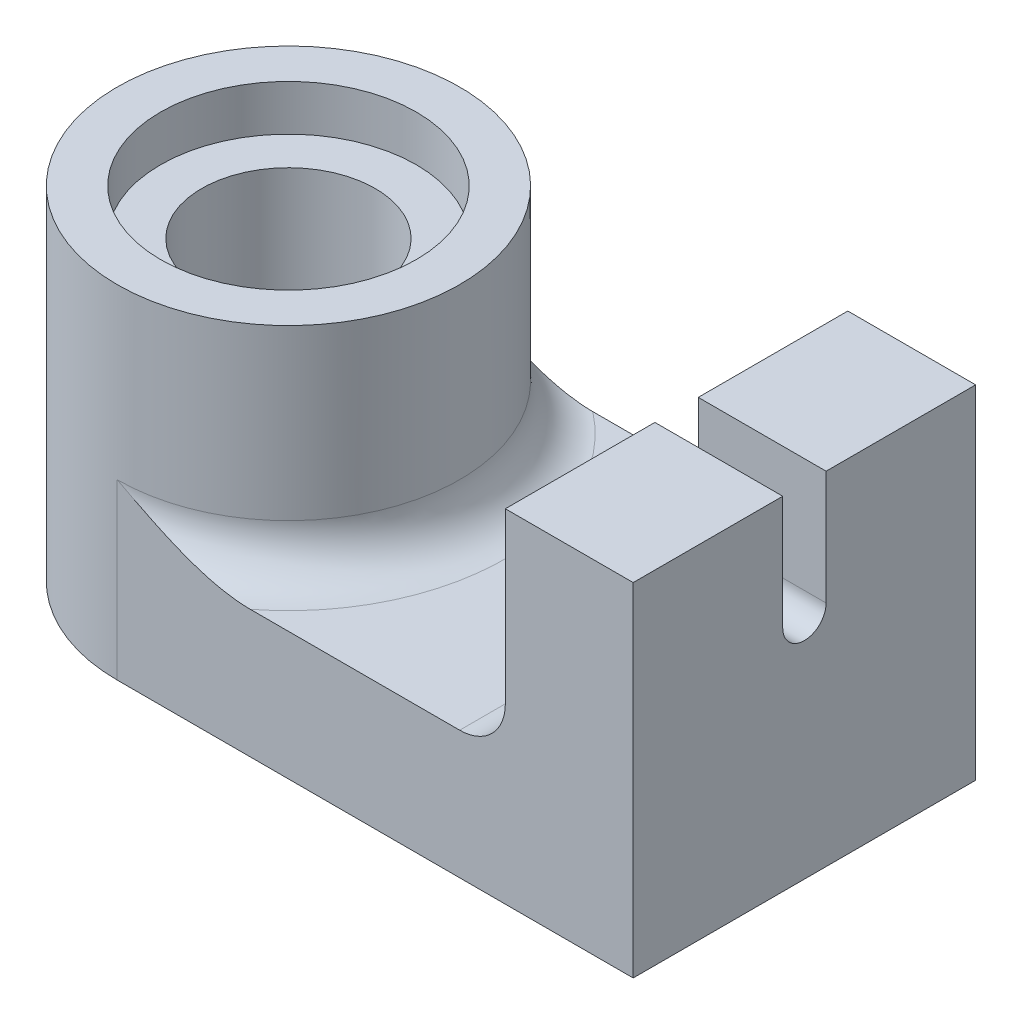
ISO-10303-21;
HEADER;
FILE_DESCRIPTION(('STEP AP214'),'2;1');
FILE_NAME('part.step','',(''),(''),'','','');
FILE_SCHEMA(('AUTOMOTIVE_DESIGN { 1 0 10303 214 1 1 1 1 }'));
ENDSEC;
DATA;
#1=APPLICATION_CONTEXT('core data for automotive mechanical design processes');
#2=APPLICATION_PROTOCOL_DEFINITION('international standard','automotive_design',2000,#1);
#3=PRODUCT_CONTEXT('',#1,'mechanical');
#4=PRODUCT('Part','Part','',(#3));
#5=PRODUCT_RELATED_PRODUCT_CATEGORY('part','',(#4));
#6=PRODUCT_DEFINITION_FORMATION('','',#4);
#7=PRODUCT_DEFINITION_CONTEXT('part definition',#1,'design');
#8=PRODUCT_DEFINITION('design','',#6,#7);
#9=PRODUCT_DEFINITION_SHAPE('','',#8);
#10=(LENGTH_UNIT() NAMED_UNIT(*) SI_UNIT(.MILLI.,.METRE.));
#11=(NAMED_UNIT(*) PLANE_ANGLE_UNIT() SI_UNIT($,.RADIAN.));
#12=(NAMED_UNIT(*) SI_UNIT($,.STERADIAN.) SOLID_ANGLE_UNIT());
#13=UNCERTAINTY_MEASURE_WITH_UNIT(LENGTH_MEASURE(1.E-05),#10,'distance_accuracy_value','');
#14=(GEOMETRIC_REPRESENTATION_CONTEXT(3) GLOBAL_UNCERTAINTY_ASSIGNED_CONTEXT((#13)) GLOBAL_UNIT_ASSIGNED_CONTEXT((#10,
#11,#12)) REPRESENTATION_CONTEXT('',''));
#15=CARTESIAN_POINT('',(0.,0.,0.));
#16=DIRECTION('',(0.,0.,1.));
#17=DIRECTION('',(1.,0.,0.));
#18=AXIS2_PLACEMENT_3D('',#15,#16,#17);
#19=CARTESIAN_POINT('',(56.5,28.,37.5));
#20=DIRECTION('',(-1.,0.,0.));
#21=DIRECTION('',(0.,0.,1.));
#22=AXIS2_PLACEMENT_3D('',#19,#20,#21);
#23=PLANE('',#22);
#24=DIRECTION('',(0.,1.,0.));
#25=VECTOR('',#24,1.);
#26=CARTESIAN_POINT('',(56.5,0.,4.74999999999999));
#27=LINE('',#26,#25);
#28=CARTESIAN_POINT('',(56.5,50.,4.74999999999999));
#29=VERTEX_POINT('',#28);
#30=CARTESIAN_POINT('',(56.5,75.,4.74999999999999));
#31=VERTEX_POINT('',#30);
#32=EDGE_CURVE('E162',#29,#31,#27,.T.);
#33=ORIENTED_EDGE('',*,*,#32,.T.);
#34=DIRECTION('',(0.,0.,-1.));
#35=VECTOR('',#34,1.);
#36=CARTESIAN_POINT('',(56.5,75.,-37.5));
#37=LINE('',#36,#35);
#38=CARTESIAN_POINT('',(56.5,75.,37.5));
#39=VERTEX_POINT('',#38);
#40=EDGE_CURVE('E182',#39,#31,#37,.T.);
#41=ORIENTED_EDGE('',*,*,#40,.F.);
#42=DIRECTION('',(0.,-1.,0.));
#43=VECTOR('',#42,1.);
#44=CARTESIAN_POINT('',(56.5,28.,37.5));
#45=LINE('',#44,#43);
#46=CARTESIAN_POINT('',(56.5,0.,37.5));
#47=VERTEX_POINT('',#46);
#48=EDGE_CURVE('E256',#39,#47,#45,.T.);
#49=ORIENTED_EDGE('',*,*,#48,.T.);
#50=DIRECTION('',(0.,0.,-1.));
#51=VECTOR('',#50,1.);
#52=CARTESIAN_POINT('',(56.5,0.,37.5));
#53=LINE('',#52,#51);
#54=CARTESIAN_POINT('',(56.5,0.,-37.5));
#55=VERTEX_POINT('',#54);
#56=EDGE_CURVE('E248',#47,#55,#53,.T.);
#57=ORIENTED_EDGE('',*,*,#56,.T.);
#58=DIRECTION('',(0.,-1.,0.));
#59=VECTOR('',#58,1.);
#60=CARTESIAN_POINT('',(56.5,28.,-37.5));
#61=LINE('',#60,#59);
#62=CARTESIAN_POINT('',(56.5,75.,-37.5));
#63=VERTEX_POINT('',#62);
#64=EDGE_CURVE('E259',#63,#55,#61,.T.);
#65=ORIENTED_EDGE('',*,*,#64,.F.);
#66=CARTESIAN_POINT('',(56.5,75.,-4.75));
#67=VERTEX_POINT('',#66);
#68=EDGE_CURVE('E174',#67,#63,#37,.T.);
#69=ORIENTED_EDGE('',*,*,#68,.F.);
#70=DIRECTION('',(0.,1.,0.));
#71=VECTOR('',#70,1.);
#72=CARTESIAN_POINT('',(56.5,0.,-4.75));
#73=LINE('',#72,#71);
#74=CARTESIAN_POINT('',(56.5,50.,-4.75));
#75=VERTEX_POINT('',#74);
#76=EDGE_CURVE('E155',#75,#67,#73,.T.);
#77=ORIENTED_EDGE('',*,*,#76,.F.);
#78=CARTESIAN_POINT('',(56.5,50.,0.));
#79=DIRECTION('',(1.,0.,0.));
#80=DIRECTION('',(0.,0.,-1.));
#81=AXIS2_PLACEMENT_3D('',#78,#79,#80);
#82=CIRCLE('',#81,4.75);
#83=EDGE_CURVE('E165',#29,#75,#82,.T.);
#84=ORIENTED_EDGE('',*,*,#83,.F.);
#85=EDGE_LOOP('',(#33,#41,#49,#57,#65,#69,#77,#84));
#86=FACE_BOUND('',#85,.T.);
#87=ADVANCED_FACE('F39',(#86),#23,.F.);
#88=CARTESIAN_POINT('',(28.5,75.,-37.5));
#89=DIRECTION('',(1.,0.,0.));
#90=DIRECTION('',(0.,0.,-1.));
#91=AXIS2_PLACEMENT_3D('',#88,#89,#90);
#92=PLANE('',#91);
#93=DIRECTION('',(0.,-1.,0.));
#94=VECTOR('',#93,1.);
#95=CARTESIAN_POINT('',(28.5,75.,-37.5));
#96=LINE('',#95,#94);
#97=CARTESIAN_POINT('',(28.5,75.,-37.5));
#98=VERTEX_POINT('',#97);
#99=CARTESIAN_POINT('',(28.5,38.,-37.5));
#100=VERTEX_POINT('',#99);
#101=EDGE_CURVE('E196',#98,#100,#96,.T.);
#102=ORIENTED_EDGE('',*,*,#101,.T.);
#103=DIRECTION('',(0.,0.,1.));
#104=VECTOR('',#103,1.);
#105=CARTESIAN_POINT('',(28.5,38.,37.5));
#106=LINE('',#105,#104);
#107=CARTESIAN_POINT('',(28.5,38.,37.5));
#108=VERTEX_POINT('',#107);
#109=EDGE_CURVE('E371',#100,#108,#106,.T.);
#110=ORIENTED_EDGE('',*,*,#109,.T.);
#111=DIRECTION('',(0.,-1.,0.));
#112=VECTOR('',#111,1.);
#113=CARTESIAN_POINT('',(28.5,75.,37.5));
#114=LINE('',#113,#112);
#115=CARTESIAN_POINT('',(28.5,75.,37.5));
#116=VERTEX_POINT('',#115);
#117=EDGE_CURVE('E194',#116,#108,#114,.T.);
#118=ORIENTED_EDGE('',*,*,#117,.F.);
#119=DIRECTION('',(0.,0.,1.));
#120=VECTOR('',#119,1.);
#121=CARTESIAN_POINT('',(28.5,75.,-37.5));
#122=LINE('',#121,#120);
#123=CARTESIAN_POINT('',(28.5,75.,4.74999999999999));
#124=VERTEX_POINT('',#123);
#125=EDGE_CURVE('E187',#124,#116,#122,.T.);
#126=ORIENTED_EDGE('',*,*,#125,.F.);
#127=DIRECTION('',(0.,1.,0.));
#128=VECTOR('',#127,1.);
#129=CARTESIAN_POINT('',(28.5,75.,4.75));
#130=LINE('',#129,#128);
#131=CARTESIAN_POINT('',(28.5,50.,4.74999999999999));
#132=VERTEX_POINT('',#131);
#133=EDGE_CURVE('E180',#132,#124,#130,.T.);
#134=ORIENTED_EDGE('',*,*,#133,.F.);
#135=CARTESIAN_POINT('',(28.5,50.,0.));
#136=DIRECTION('',(1.,0.,0.));
#137=DIRECTION('',(0.,0.,-1.));
#138=AXIS2_PLACEMENT_3D('',#135,#136,#137);
#139=CIRCLE('',#138,4.75);
#140=CARTESIAN_POINT('',(28.5,50.,-4.75));
#141=VERTEX_POINT('',#140);
#142=EDGE_CURVE('E373',#132,#141,#139,.T.);
#143=ORIENTED_EDGE('',*,*,#142,.T.);
#144=DIRECTION('',(0.,1.,0.));
#145=VECTOR('',#144,1.);
#146=CARTESIAN_POINT('',(28.5,75.,-4.75));
#147=LINE('',#146,#145);
#148=CARTESIAN_POINT('',(28.5,75.,-4.75));
#149=VERTEX_POINT('',#148);
#150=EDGE_CURVE('E158',#141,#149,#147,.T.);
#151=ORIENTED_EDGE('',*,*,#150,.T.);
#152=EDGE_CURVE('E188',#98,#149,#122,.T.);
#153=ORIENTED_EDGE('',*,*,#152,.F.);
#154=EDGE_LOOP('',(#102,#110,#118,#126,#134,#143,#151,#153));
#155=FACE_BOUND('',#154,.T.);
#156=ADVANCED_FACE('F316',(#155),#92,.F.);
#157=CARTESIAN_POINT('',(0.,75.,0.));
#158=DIRECTION('',(0.,-1.,0.));
#159=DIRECTION('',(0.,0.,-1.));
#160=AXIS2_PLACEMENT_3D('',#157,#158,#159);
#161=PLANE('',#160);
#162=DIRECTION('',(1.,0.,0.));
#163=VECTOR('',#162,1.);
#164=CARTESIAN_POINT('',(0.,75.,4.74999999999999));
#165=LINE('',#164,#163);
#166=EDGE_CURVE('E377',#124,#31,#165,.T.);
#167=ORIENTED_EDGE('',*,*,#166,.F.);
#168=ORIENTED_EDGE('',*,*,#125,.T.);
#169=DIRECTION('',(1.,0.,0.));
#170=VECTOR('',#169,1.);
#171=CARTESIAN_POINT('',(56.5,75.,37.5));
#172=LINE('',#171,#170);
#173=EDGE_CURVE('E191',#116,#39,#172,.T.);
#174=ORIENTED_EDGE('',*,*,#173,.T.);
#175=ORIENTED_EDGE('',*,*,#40,.T.);
#176=EDGE_LOOP('',(#167,#168,#174,#175));
#177=FACE_BOUND('',#176,.T.);
#178=ADVANCED_FACE('F321',(#177),#161,.F.);
#179=CARTESIAN_POINT('',(0.,28.,0.));
#180=DIRECTION('',(0.,-1.,0.));
#181=DIRECTION('',(0.,0.,-1.));
#182=AXIS2_PLACEMENT_3D('',#179,#180,#181);
#183=PLANE('',#182);
#184=DIRECTION('',(1.,0.,0.));
#185=VECTOR('',#184,1.);
#186=CARTESIAN_POINT('',(-56.5,28.,37.5));
#187=LINE('',#186,#185);
#188=CARTESIAN_POINT('',(-27.3452405257735,28.,37.5));
#189=VERTEX_POINT('',#188);
#190=CARTESIAN_POINT('',(18.5,28.,37.5));
#191=VERTEX_POINT('',#190);
#192=EDGE_CURVE('E242',#189,#191,#187,.T.);
#193=ORIENTED_EDGE('',*,*,#192,.T.);
#194=DIRECTION('',(0.,0.,1.));
#195=VECTOR('',#194,1.);
#196=CARTESIAN_POINT('',(18.5,28.,-37.5));
#197=LINE('',#196,#195);
#198=CARTESIAN_POINT('',(18.5,28.,-37.5));
#199=VERTEX_POINT('',#198);
#200=EDGE_CURVE('E60',#191,#199,#197,.F.);
#201=ORIENTED_EDGE('',*,*,#200,.T.);
#202=DIRECTION('',(1.,0.,0.));
#203=VECTOR('',#202,1.);
#204=CARTESIAN_POINT('',(-56.5,28.,-37.5));
#205=LINE('',#204,#203);
#206=CARTESIAN_POINT('',(-27.3452405257735,28.,-37.5));
#207=VERTEX_POINT('',#206);
#208=EDGE_CURVE('E240',#207,#199,#205,.T.);
#209=ORIENTED_EDGE('',*,*,#208,.F.);
#210=CARTESIAN_POINT('',(-56.5,28.,0.));
#211=DIRECTION('',(0.,-1.,0.));
#212=DIRECTION('',(0.,0.,-1.));
#213=AXIS2_PLACEMENT_3D('',#210,#211,#212);
#214=CIRCLE('',#213,47.5);
#215=EDGE_CURVE('E266',#207,#189,#214,.T.);
#216=ORIENTED_EDGE('',*,*,#215,.T.);
#217=EDGE_LOOP('',(#193,#201,#209,#216));
#218=FACE_BOUND('',#217,.T.);
#219=ADVANCED_FACE('F328',(#218),#183,.F.);
#220=CARTESIAN_POINT('',(-56.5,-54.,0.));
#221=DIRECTION('',(0.,1.,0.));
#222=DIRECTION('',(0.,0.,1.));
#223=AXIS2_PLACEMENT_3D('',#220,#221,#222);
#224=CYLINDRICAL_SURFACE('',#223,19.);
#225=CARTESIAN_POINT('',(-56.5,9.99999999999999,0.));
#226=DIRECTION('',(0.,-1.,0.));
#227=DIRECTION('',(0.,0.,-1.));
#228=AXIS2_PLACEMENT_3D('',#225,#226,#227);
#229=CIRCLE('',#228,19.);
#230=CARTESIAN_POINT('',(-38.1696972201766,9.99999999999999,-4.99999999999999));
#231=VERTEX_POINT('',#230);
#232=CARTESIAN_POINT('',(-38.1696972201766,9.99999999999999,5.00000000000001));
#233=VERTEX_POINT('',#232);
#234=EDGE_CURVE('E211',#231,#233,#229,.F.);
#235=ORIENTED_EDGE('',*,*,#234,.F.);
#236=DIRECTION('',(0.,1.,0.));
#237=VECTOR('',#236,1.);
#238=CARTESIAN_POINT('',(-38.1696972201766,-54.,-4.99999999999999));
#239=LINE('',#238,#237);
#240=CARTESIAN_POINT('',(-38.1696972201766,65.,-4.99999999999999));
#241=VERTEX_POINT('',#240);
#242=EDGE_CURVE('E226',#231,#241,#239,.T.);
#243=ORIENTED_EDGE('',*,*,#242,.T.);
#244=CARTESIAN_POINT('',(-56.5,65.,0.));
#245=DIRECTION('',(0.,1.,0.));
#246=DIRECTION('',(0.,0.,1.));
#247=AXIS2_PLACEMENT_3D('',#244,#245,#246);
#248=CIRCLE('',#247,19.);
#249=CARTESIAN_POINT('',(-38.1696972201766,65.,5.00000000000001));
#250=VERTEX_POINT('',#249);
#251=EDGE_CURVE('E213',#241,#250,#248,.T.);
#252=ORIENTED_EDGE('',*,*,#251,.T.);
#253=DIRECTION('',(0.,1.,0.));
#254=VECTOR('',#253,1.);
#255=CARTESIAN_POINT('',(-38.1696972201766,-54.,5.00000000000001));
#256=LINE('',#255,#254);
#257=EDGE_CURVE('E225',#233,#250,#256,.T.);
#258=ORIENTED_EDGE('',*,*,#257,.F.);
#259=EDGE_LOOP('',(#235,#243,#252,#258));
#260=FACE_BOUND('',#259,.T.);
#261=ADVANCED_FACE('F347',(#260),#224,.F.);
#262=CARTESIAN_POINT('',(0.,-54.,-4.99999999999999));
#263=DIRECTION('',(0.,0.,1.));
#264=DIRECTION('',(1.,0.,0.));
#265=AXIS2_PLACEMENT_3D('',#262,#263,#264);
#266=PLANE('',#265);
#267=ORIENTED_EDGE('',*,*,#242,.F.);
#268=DIRECTION('',(1.,0.,0.));
#269=VECTOR('',#268,1.);
#270=CARTESIAN_POINT('',(0.,9.99999999999999,-4.99999999999999));
#271=LINE('',#270,#269);
#272=CARTESIAN_POINT('',(-34.5,9.99999999999999,-4.99999999999999));
#273=VERTEX_POINT('',#272);
#274=EDGE_CURVE('E208',#231,#273,#271,.T.);
#275=ORIENTED_EDGE('',*,*,#274,.T.);
#276=DIRECTION('',(0.,1.,0.));
#277=VECTOR('',#276,1.);
#278=CARTESIAN_POINT('',(-34.5,-54.,-4.99999999999999));
#279=LINE('',#278,#277);
#280=CARTESIAN_POINT('',(-34.5,65.,-4.99999999999999));
#281=VERTEX_POINT('',#280);
#282=EDGE_CURVE('E229',#273,#281,#279,.T.);
#283=ORIENTED_EDGE('',*,*,#282,.T.);
#284=DIRECTION('',(1.,0.,0.));
#285=VECTOR('',#284,1.);
#286=CARTESIAN_POINT('',(0.,65.,-4.99999999999999));
#287=LINE('',#286,#285);
#288=EDGE_CURVE('E222',#241,#281,#287,.T.);
#289=ORIENTED_EDGE('',*,*,#288,.F.);
#290=EDGE_LOOP('',(#267,#275,#283,#289));
#291=FACE_BOUND('',#290,.T.);
#292=ADVANCED_FACE('F343',(#291),#266,.T.);
#293=CARTESIAN_POINT('',(-34.5,-54.,0.));
#294=DIRECTION('',(-1.,0.,0.));
#295=DIRECTION('',(0.,0.,1.));
#296=AXIS2_PLACEMENT_3D('',#293,#294,#295);
#297=PLANE('',#296);
#298=ORIENTED_EDGE('',*,*,#282,.F.);
#299=DIRECTION('',(0.,0.,1.));
#300=VECTOR('',#299,1.);
#301=CARTESIAN_POINT('',(-34.5,9.99999999999999,0.));
#302=LINE('',#301,#300);
#303=CARTESIAN_POINT('',(-34.5,9.99999999999999,5.00000000000001));
#304=VERTEX_POINT('',#303);
#305=EDGE_CURVE('E203',#273,#304,#302,.T.);
#306=ORIENTED_EDGE('',*,*,#305,.T.);
#307=DIRECTION('',(0.,1.,0.));
#308=VECTOR('',#307,1.);
#309=CARTESIAN_POINT('',(-34.5,-54.,5.00000000000001));
#310=LINE('',#309,#308);
#311=CARTESIAN_POINT('',(-34.5,65.,5.00000000000001));
#312=VERTEX_POINT('',#311);
#313=EDGE_CURVE('E231',#304,#312,#310,.T.);
#314=ORIENTED_EDGE('',*,*,#313,.T.);
#315=DIRECTION('',(0.,0.,1.));
#316=VECTOR('',#315,1.);
#317=CARTESIAN_POINT('',(-34.5,65.,0.));
#318=LINE('',#317,#316);
#319=EDGE_CURVE('E219',#281,#312,#318,.T.);
#320=ORIENTED_EDGE('',*,*,#319,.F.);
#321=EDGE_LOOP('',(#298,#306,#314,#320));
#322=FACE_BOUND('',#321,.T.);
#323=ADVANCED_FACE('F346',(#322),#297,.T.);
#324=CARTESIAN_POINT('',(0.,-54.,5.00000000000001));
#325=DIRECTION('',(0.,0.,1.));
#326=DIRECTION('',(1.,0.,0.));
#327=AXIS2_PLACEMENT_3D('',#324,#325,#326);
#328=PLANE('',#327);
#329=DIRECTION('',(1.,0.,0.));
#330=VECTOR('',#329,1.);
#331=CARTESIAN_POINT('',(0.,9.99999999999999,5.00000000000001));
#332=LINE('',#331,#330);
#333=EDGE_CURVE('E380',#233,#304,#332,.T.);
#334=ORIENTED_EDGE('',*,*,#333,.F.);
#335=ORIENTED_EDGE('',*,*,#257,.T.);
#336=DIRECTION('',(1.,0.,0.));
#337=VECTOR('',#336,1.);
#338=CARTESIAN_POINT('',(0.,65.,5.00000000000001));
#339=LINE('',#338,#337);
#340=EDGE_CURVE('E216',#250,#312,#339,.T.);
#341=ORIENTED_EDGE('',*,*,#340,.T.);
#342=ORIENTED_EDGE('',*,*,#313,.F.);
#343=EDGE_LOOP('',(#334,#335,#341,#342));
#344=FACE_BOUND('',#343,.T.);
#345=ADVANCED_FACE('F304',(#344),#328,.F.);
#346=CARTESIAN_POINT('',(-56.5,75.,0.));
#347=DIRECTION('',(0.,-1.,0.));
#348=DIRECTION('',(0.,0.,-1.));
#349=AXIS2_PLACEMENT_3D('',#346,#347,#348);
#350=CYLINDRICAL_SURFACE('',#349,37.5);
#351=CARTESIAN_POINT('',(-56.5,75.,0.));
#352=DIRECTION('',(0.,1.,0.));
#353=DIRECTION('',(0.,0.,1.));
#354=AXIS2_PLACEMENT_3D('',#351,#352,#353);
#355=CIRCLE('',#354,37.5);
#356=CARTESIAN_POINT('',(-56.5,75.,37.5));
#357=VERTEX_POINT('',#356);
#358=EDGE_CURVE('E263',#357,#357,#355,.T.);
#359=ORIENTED_EDGE('',*,*,#358,.F.);
#360=EDGE_LOOP('',(#359));
#361=FACE_BOUND('',#360,.T.);
#362=DIRECTION('',(0.,-1.,0.));
#363=VECTOR('',#362,1.);
#364=CARTESIAN_POINT('',(-56.5,28.,37.5));
#365=LINE('',#364,#363);
#366=CARTESIAN_POINT('',(-56.5,38.,37.5));
#367=VERTEX_POINT('',#366);
#368=CARTESIAN_POINT('',(-56.5,0.,37.5));
#369=VERTEX_POINT('',#368);
#370=EDGE_CURVE('E252',#367,#369,#365,.T.);
#371=ORIENTED_EDGE('',*,*,#370,.F.);
#372=CARTESIAN_POINT('',(-56.5,38.,0.));
#373=DIRECTION('',(0.,-1.,0.));
#374=DIRECTION('',(0.,0.,-1.));
#375=AXIS2_PLACEMENT_3D('',#372,#373,#374);
#376=CIRCLE('',#375,37.5);
#377=CARTESIAN_POINT('',(-56.5,38.,-37.5));
#378=VERTEX_POINT('',#377);
#379=EDGE_CURVE('E270',#367,#378,#376,.F.);
#380=ORIENTED_EDGE('',*,*,#379,.T.);
#381=DIRECTION('',(0.,-1.,0.));
#382=VECTOR('',#381,1.);
#383=CARTESIAN_POINT('',(-56.5,28.,-37.5));
#384=LINE('',#383,#382);
#385=CARTESIAN_POINT('',(-56.5,0.,-37.5));
#386=VERTEX_POINT('',#385);
#387=EDGE_CURVE('E245',#378,#386,#384,.T.);
#388=ORIENTED_EDGE('',*,*,#387,.T.);
#389=CARTESIAN_POINT('',(-56.5,0.,0.));
#390=DIRECTION('',(0.,1.,0.));
#391=DIRECTION('',(0.,0.,1.));
#392=AXIS2_PLACEMENT_3D('',#389,#390,#391);
#393=CIRCLE('',#392,37.5);
#394=EDGE_CURVE('E255',#386,#369,#393,.T.);
#395=ORIENTED_EDGE('',*,*,#394,.T.);
#396=EDGE_LOOP('',(#371,#380,#388,#395));
#397=FACE_BOUND('',#396,.T.);
#398=ADVANCED_FACE('F299',(#361,#397),#350,.T.);
#399=CARTESIAN_POINT('',(0.,75.,0.));
#400=DIRECTION('',(0.,1.,0.));
#401=DIRECTION('',(0.,0.,1.));
#402=AXIS2_PLACEMENT_3D('',#399,#400,#401);
#403=PLANE('',#402);
#404=CARTESIAN_POINT('',(-56.5,75.,0.));
#405=DIRECTION('',(0.,1.,0.));
#406=DIRECTION('',(0.,0.,1.));
#407=AXIS2_PLACEMENT_3D('',#404,#405,#406);
#408=CIRCLE('',#407,28.);
#409=CARTESIAN_POINT('',(-56.5,75.,28.));
#410=VERTEX_POINT('',#409);
#411=EDGE_CURVE('E228',#410,#410,#408,.T.);
#412=ORIENTED_EDGE('',*,*,#411,.F.);
#413=EDGE_LOOP('',(#412));
#414=FACE_BOUND('',#413,.T.);
#415=ORIENTED_EDGE('',*,*,#358,.T.);
#416=EDGE_LOOP('',(#415));
#417=FACE_BOUND('',#416,.T.);
#418=ADVANCED_FACE('F303',(#414,#417),#403,.T.);
#419=CARTESIAN_POINT('',(0.,0.,0.));
#420=DIRECTION('',(0.,1.,0.));
#421=DIRECTION('',(0.,0.,1.));
#422=AXIS2_PLACEMENT_3D('',#419,#420,#421);
#423=PLANE('',#422);
#424=CARTESIAN_POINT('',(-56.5,0.,0.));
#425=DIRECTION('',(0.,-1.,0.));
#426=DIRECTION('',(0.,0.,-1.));
#427=AXIS2_PLACEMENT_3D('',#424,#425,#426);
#428=CIRCLE('',#427,28.);
#429=CARTESIAN_POINT('',(-56.5,0.,-28.));
#430=VERTEX_POINT('',#429);
#431=EDGE_CURVE('E199',#430,#430,#428,.T.);
#432=ORIENTED_EDGE('',*,*,#431,.F.);
#433=EDGE_LOOP('',(#432));
#434=FACE_BOUND('',#433,.T.);
#435=ORIENTED_EDGE('',*,*,#394,.F.);
#436=DIRECTION('',(1.,0.,0.));
#437=VECTOR('',#436,1.);
#438=CARTESIAN_POINT('',(-56.5,0.,-37.5));
#439=LINE('',#438,#437);
#440=EDGE_CURVE('E237',#386,#55,#439,.T.);
#441=ORIENTED_EDGE('',*,*,#440,.T.);
#442=ORIENTED_EDGE('',*,*,#56,.F.);
#443=DIRECTION('',(1.,0.,0.));
#444=VECTOR('',#443,1.);
#445=CARTESIAN_POINT('',(-56.5,0.,37.5));
#446=LINE('',#445,#444);
#447=EDGE_CURVE('E243',#369,#47,#446,.T.);
#448=ORIENTED_EDGE('',*,*,#447,.F.);
#449=EDGE_LOOP('',(#435,#441,#442,#448));
#450=FACE_BOUND('',#449,.T.);
#451=ADVANCED_FACE('F306',(#434,#450),#423,.F.);
#452=CARTESIAN_POINT('',(-56.5,28.,37.5));
#453=DIRECTION('',(0.,0.,-1.));
#454=DIRECTION('',(-1.,0.,0.));
#455=AXIS2_PLACEMENT_3D('',#452,#453,#454);
#456=PLANE('',#455);
#457=ORIENTED_EDGE('',*,*,#447,.T.);
#458=ORIENTED_EDGE('',*,*,#48,.F.);
#459=ORIENTED_EDGE('',*,*,#173,.F.);
#460=ORIENTED_EDGE('',*,*,#117,.T.);
#461=CARTESIAN_POINT('',(18.5,38.,37.5));
#462=DIRECTION('',(0.,0.,-1.));
#463=DIRECTION('',(-1.,0.,0.));
#464=AXIS2_PLACEMENT_3D('',#461,#462,#463);
#465=CIRCLE('',#464,10.);
#466=EDGE_CURVE('E47',#108,#191,#465,.T.);
#467=ORIENTED_EDGE('',*,*,#466,.T.);
#468=ORIENTED_EDGE('',*,*,#192,.F.);
#469=CARTESIAN_POINT('',(-27.3452405257735,28.,37.5));
#470=CARTESIAN_POINT('',(-27.7718306786814,28.0000213351898,37.5));
#471=CARTESIAN_POINT('',(-28.1983439980087,28.0102823714578,37.5));
#472=CARTESIAN_POINT('',(-29.0503515250905,28.0497436177265,37.5));
#473=CARTESIAN_POINT('',(-29.4758460433027,28.078937038766,37.5));
#474=CARTESIAN_POINT('',(-30.3244061649618,28.1546490977715,37.5));
#475=CARTESIAN_POINT('',(-30.747474927234,28.2011328970027,37.5));
#476=CARTESIAN_POINT('',(-31.5915690352663,28.3100570735705,37.5));
#477=CARTESIAN_POINT('',(-32.0125941747222,28.3724990290993,37.5));
#478=CARTESIAN_POINT('',(-33.2616269037703,28.580089301683,37.5));
#479=CARTESIAN_POINT('',(-34.0861499526015,28.7465122101843,37.5));
#480=CARTESIAN_POINT('',(-35.7241867313919,29.1277255658476,37.5));
#481=CARTESIAN_POINT('',(-36.5376938134142,29.3425439504553,37.5));
#482=CARTESIAN_POINT('',(-38.1795375646953,29.8206084774624,37.5));
#483=CARTESIAN_POINT('',(-39.0074728141438,30.0852230909796,37.5));
#484=CARTESIAN_POINT('',(-40.6510368607434,30.6504595312026,37.5));
#485=CARTESIAN_POINT('',(-41.4666630412164,30.9510888958708,37.5));
#486=CARTESIAN_POINT('',(-43.0867888174623,31.5819324738853,37.5));
#487=CARTESIAN_POINT('',(-43.8912825951814,31.912161529161,37.5));
#488=CARTESIAN_POINT('',(-45.4901869660439,32.5962759351057,37.5));
#489=CARTESIAN_POINT('',(-46.2845964908571,32.9501637677155,37.5));
#490=CARTESIAN_POINT('',(-48.6631051214195,34.0428931216527,37.5));
#491=CARTESIAN_POINT('',(-50.2343631940747,34.8095165084881,37.5000000000002));
#492=CARTESIAN_POINT('',(-53.3589614292049,36.3781249223035,37.4999999999998));
#493=CARTESIAN_POINT('',(-54.9122986517586,37.1801156500963,37.4999999999994));
#494=CARTESIAN_POINT('',(-56.4770584256125,37.9881530227578,37.5));
#495=CARTESIAN_POINT('',(-56.4885292123012,37.9940765115445,37.5));
#496=CARTESIAN_POINT('',(-56.5,38.,37.5));
#497=B_SPLINE_CURVE_WITH_KNOTS('',3,(#469,#470,#471,#472,#473,#474,#475,#476,#477,#478,#479,
#480,#481,#482,#483,#484,#485,#486,#487,#488,#489,#490,#491,#492,#493,#494,#495,#496),
.UNSPECIFIED.,.F.,.F.,(4,2,2,2,2,2,2,2,2,2,2,2,2,4),(0.,1.2795357137804,2.5586128525355,
3.83512659171381,5.11176662142294,7.63330150530475,10.156295752437,12.7628652516174,
15.3699812675248,17.9784119403758,20.5871166831845,25.8307743780207,31.0752804024458,
31.1140102359087),.UNSPECIFIED.);
#498=EDGE_CURVE('E273',#189,#367,#497,.T.);
#499=ORIENTED_EDGE('',*,*,#498,.T.);
#500=ORIENTED_EDGE('',*,*,#370,.T.);
#501=EDGE_LOOP('',(#457,#458,#459,#460,#467,#468,#499,#500));
#502=FACE_BOUND('',#501,.T.);
#503=ADVANCED_FACE('F288',(#502),#456,.F.);
#504=CARTESIAN_POINT('',(-56.5,28.,-37.5));
#505=DIRECTION('',(0.,0.,-1.));
#506=DIRECTION('',(-1.,0.,0.));
#507=AXIS2_PLACEMENT_3D('',#504,#505,#506);
#508=PLANE('',#507);
#509=ORIENTED_EDGE('',*,*,#440,.F.);
#510=ORIENTED_EDGE('',*,*,#387,.F.);
#511=CARTESIAN_POINT('',(-27.3452405257735,28.,-37.5));
#512=CARTESIAN_POINT('',(-27.7718306786802,28.0000213351898,-37.5));
#513=CARTESIAN_POINT('',(-28.1983439980063,28.0102823714577,-37.5));
#514=CARTESIAN_POINT('',(-29.0503515250857,28.0497436177263,-37.5));
#515=CARTESIAN_POINT('',(-29.4758460432968,28.0789370387655,-37.5));
#516=CARTESIAN_POINT('',(-30.3244061649538,28.1546490977707,-37.5));
#517=CARTESIAN_POINT('',(-30.747474927225,28.2011328970016,-37.5));
#518=CARTESIAN_POINT('',(-31.5915690352555,28.310057073569,-37.5));
#519=CARTESIAN_POINT('',(-32.0125941747105,28.3724990290975,-37.5));
#520=CARTESIAN_POINT('',(-33.26162690376,28.580089301681,-37.5));
#521=CARTESIAN_POINT('',(-34.0861499525935,28.7465122101826,-37.5));
#522=CARTESIAN_POINT('',(-35.7241867313881,29.1277255658466,-37.5));
#523=CARTESIAN_POINT('',(-36.5376938134123,29.3425439504548,-37.5));
#524=CARTESIAN_POINT('',(-38.1795375646956,29.8206084774625,-37.5));
#525=CARTESIAN_POINT('',(-39.0074728141445,30.0852230909798,-37.5));
#526=CARTESIAN_POINT('',(-40.6510368607447,30.650459531203,-37.5));
#527=CARTESIAN_POINT('',(-41.466663041218,30.9510888958713,-37.5));
#528=CARTESIAN_POINT('',(-43.0867888174649,31.5819324738864,-37.5));
#529=CARTESIAN_POINT('',(-43.8912825951847,31.9121615291628,-37.5));
#530=CARTESIAN_POINT('',(-45.4901869660492,32.5962759351075,-37.5));
#531=CARTESIAN_POINT('',(-46.2845964908638,32.9501637677166,-37.5));
#532=CARTESIAN_POINT('',(-48.6631051214236,34.0428931216585,-37.5));
#533=CARTESIAN_POINT('',(-50.234363194071,34.8095165085072,-37.5000000000001));
#534=CARTESIAN_POINT('',(-53.3589614292163,36.3781249222883,-37.4999999999999));
#535=CARTESIAN_POINT('',(-54.9122986517931,37.1801156500334,-37.4999999999997));
#536=CARTESIAN_POINT('',(-56.4770584256132,37.988153022757,-37.5));
#537=CARTESIAN_POINT('',(-56.4885292123016,37.9940765115441,-37.5));
#538=CARTESIAN_POINT('',(-56.5,38.,-37.5));
#539=B_SPLINE_CURVE_WITH_KNOTS('',3,(#511,#512,#513,#514,#515,#516,#517,#518,#519,#520,#521,
#522,#523,#524,#525,#526,#527,#528,#529,#530,#531,#532,#533,#534,#535,#536,#537,#538),
.UNSPECIFIED.,.F.,.F.,(4,2,2,2,2,2,2,2,2,2,2,2,2,4),(0.,1.27953571377681,2.55861285252832,
3.83512659170382,5.11176662141014,7.63330150529884,10.156295752437,12.7628652516186,
15.3699812675266,17.9784119403805,20.5871166831917,25.8307743780252,31.0752804024462,
31.1140102359086),.UNSPECIFIED.);
#540=EDGE_CURVE('E281',#378,#207,#539,.F.);
#541=ORIENTED_EDGE('',*,*,#540,.T.);
#542=ORIENTED_EDGE('',*,*,#208,.T.);
#543=CARTESIAN_POINT('',(18.5,38.,-37.5));
#544=DIRECTION('',(0.,0.,-1.));
#545=DIRECTION('',(-1.,0.,0.));
#546=AXIS2_PLACEMENT_3D('',#543,#544,#545);
#547=CIRCLE('',#546,10.);
#548=EDGE_CURVE('E11',#199,#100,#547,.F.);
#549=ORIENTED_EDGE('',*,*,#548,.T.);
#550=ORIENTED_EDGE('',*,*,#101,.F.);
#551=DIRECTION('',(-1.,0.,0.));
#552=VECTOR('',#551,1.);
#553=CARTESIAN_POINT('',(56.5,75.,-37.5));
#554=LINE('',#553,#552);
#555=EDGE_CURVE('E185',#63,#98,#554,.T.);
#556=ORIENTED_EDGE('',*,*,#555,.F.);
#557=ORIENTED_EDGE('',*,*,#64,.T.);
#558=EDGE_LOOP('',(#509,#510,#541,#542,#549,#550,#556,#557));
#559=FACE_BOUND('',#558,.T.);
#560=ADVANCED_FACE('F297',(#559),#508,.T.);
#561=CARTESIAN_POINT('',(-56.5,38.,0.));
#562=DIRECTION('',(0.,-1.,0.));
#563=DIRECTION('',(0.,0.,-1.));
#564=AXIS2_PLACEMENT_3D('',#561,#562,#563);
#565=TOROIDAL_SURFACE('',#564,47.5,10.);
#566=ORIENTED_EDGE('',*,*,#540,.F.);
#567=ORIENTED_EDGE('',*,*,#379,.F.);
#568=ORIENTED_EDGE('',*,*,#498,.F.);
#569=ORIENTED_EDGE('',*,*,#215,.F.);
#570=EDGE_LOOP('',(#566,#567,#568,#569));
#571=FACE_BOUND('',#570,.T.);
#572=ADVANCED_FACE('F292',(#571),#565,.F.);
#573=CARTESIAN_POINT('',(-56.5,65.,0.));
#574=DIRECTION('',(0.,1.,0.));
#575=DIRECTION('',(0.,0.,1.));
#576=AXIS2_PLACEMENT_3D('',#573,#574,#575);
#577=CYLINDRICAL_SURFACE('',#576,28.);
#578=CARTESIAN_POINT('',(-56.5,65.,0.));
#579=DIRECTION('',(0.,1.,0.));
#580=DIRECTION('',(0.,0.,1.));
#581=AXIS2_PLACEMENT_3D('',#578,#579,#580);
#582=CIRCLE('',#581,28.);
#583=CARTESIAN_POINT('',(-56.5,65.,28.));
#584=VERTEX_POINT('',#583);
#585=EDGE_CURVE('E234',#584,#584,#582,.T.);
#586=ORIENTED_EDGE('',*,*,#585,.F.);
#587=EDGE_LOOP('',(#586));
#588=FACE_BOUND('',#587,.T.);
#589=ORIENTED_EDGE('',*,*,#411,.T.);
#590=EDGE_LOOP('',(#589));
#591=FACE_BOUND('',#590,.T.);
#592=ADVANCED_FACE('F296',(#588,#591),#577,.F.);
#593=CARTESIAN_POINT('',(-56.5,65.,0.));
#594=DIRECTION('',(0.,1.,0.));
#595=DIRECTION('',(0.,0.,1.));
#596=AXIS2_PLACEMENT_3D('',#593,#594,#595);
#597=PLANE('',#596);
#598=ORIENTED_EDGE('',*,*,#251,.F.);
#599=ORIENTED_EDGE('',*,*,#288,.T.);
#600=ORIENTED_EDGE('',*,*,#319,.T.);
#601=ORIENTED_EDGE('',*,*,#340,.F.);
#602=EDGE_LOOP('',(#598,#599,#600,#601));
#603=FACE_BOUND('',#602,.T.);
#604=ORIENTED_EDGE('',*,*,#585,.T.);
#605=EDGE_LOOP('',(#604));
#606=FACE_BOUND('',#605,.T.);
#607=ADVANCED_FACE('F338',(#603,#606),#597,.T.);
#608=CARTESIAN_POINT('',(-56.5,10.,0.));
#609=DIRECTION('',(0.,-1.,0.));
#610=DIRECTION('',(0.,0.,-1.));
#611=AXIS2_PLACEMENT_3D('',#608,#609,#610);
#612=PLANE('',#611);
#613=CARTESIAN_POINT('',(-56.5,10.,0.));
#614=DIRECTION('',(0.,-1.,0.));
#615=DIRECTION('',(0.,0.,-1.));
#616=AXIS2_PLACEMENT_3D('',#613,#614,#615);
#617=CIRCLE('',#616,28.);
#618=CARTESIAN_POINT('',(-56.5,10.,-28.));
#619=VERTEX_POINT('',#618);
#620=EDGE_CURVE('E200',#619,#619,#617,.T.);
#621=ORIENTED_EDGE('',*,*,#620,.T.);
#622=EDGE_LOOP('',(#621));
#623=FACE_BOUND('',#622,.T.);
#624=ORIENTED_EDGE('',*,*,#234,.T.);
#625=ORIENTED_EDGE('',*,*,#333,.T.);
#626=ORIENTED_EDGE('',*,*,#305,.F.);
#627=ORIENTED_EDGE('',*,*,#274,.F.);
#628=EDGE_LOOP('',(#624,#625,#626,#627));
#629=FACE_BOUND('',#628,.T.);
#630=ADVANCED_FACE('F334',(#623,#629),#612,.T.);
#631=CARTESIAN_POINT('',(-56.5,10.,0.));
#632=DIRECTION('',(0.,-1.,0.));
#633=DIRECTION('',(0.,0.,-1.));
#634=AXIS2_PLACEMENT_3D('',#631,#632,#633);
#635=CYLINDRICAL_SURFACE('',#634,28.);
#636=ORIENTED_EDGE('',*,*,#620,.F.);
#637=EDGE_LOOP('',(#636));
#638=FACE_BOUND('',#637,.T.);
#639=ORIENTED_EDGE('',*,*,#431,.T.);
#640=EDGE_LOOP('',(#639));
#641=FACE_BOUND('',#640,.T.);
#642=ADVANCED_FACE('F337',(#638,#641),#635,.F.);
#643=ORIENTED_EDGE('',*,*,#152,.T.);
#644=DIRECTION('',(1.,0.,0.));
#645=VECTOR('',#644,1.);
#646=CARTESIAN_POINT('',(0.,75.,-4.75));
#647=LINE('',#646,#645);
#648=EDGE_CURVE('E379',#149,#67,#647,.T.);
#649=ORIENTED_EDGE('',*,*,#648,.T.);
#650=ORIENTED_EDGE('',*,*,#68,.T.);
#651=ORIENTED_EDGE('',*,*,#555,.T.);
#652=EDGE_LOOP('',(#643,#649,#650,#651));
#653=FACE_BOUND('',#652,.T.);
#654=ADVANCED_FACE('F331',(#653),#161,.F.);
#655=CARTESIAN_POINT('',(9.5,50.,0.));
#656=DIRECTION('',(1.,0.,0.));
#657=DIRECTION('',(0.,0.,-1.));
#658=AXIS2_PLACEMENT_3D('',#655,#656,#657);
#659=CYLINDRICAL_SURFACE('',#658,4.75);
#660=DIRECTION('',(1.,0.,0.));
#661=VECTOR('',#660,1.);
#662=CARTESIAN_POINT('',(9.5,50.,4.74999999999999));
#663=LINE('',#662,#661);
#664=EDGE_CURVE('E161',#132,#29,#663,.T.);
#665=ORIENTED_EDGE('',*,*,#664,.T.);
#666=ORIENTED_EDGE('',*,*,#83,.T.);
#667=DIRECTION('',(1.,0.,0.));
#668=VECTOR('',#667,1.);
#669=CARTESIAN_POINT('',(9.5,50.,-4.75));
#670=LINE('',#669,#668);
#671=EDGE_CURVE('E151',#141,#75,#670,.T.);
#672=ORIENTED_EDGE('',*,*,#671,.F.);
#673=ORIENTED_EDGE('',*,*,#142,.F.);
#674=EDGE_LOOP('',(#665,#666,#672,#673));
#675=FACE_BOUND('',#674,.T.);
#676=ADVANCED_FACE('F166',(#675),#659,.F.);
#677=CARTESIAN_POINT('',(9.5,0.,4.74999999999999));
#678=DIRECTION('',(0.,0.,-1.));
#679=DIRECTION('',(-1.,0.,0.));
#680=AXIS2_PLACEMENT_3D('',#677,#678,#679);
#681=PLANE('',#680);
#682=ORIENTED_EDGE('',*,*,#133,.T.);
#683=ORIENTED_EDGE('',*,*,#166,.T.);
#684=ORIENTED_EDGE('',*,*,#32,.F.);
#685=ORIENTED_EDGE('',*,*,#664,.F.);
#686=EDGE_LOOP('',(#682,#683,#684,#685));
#687=FACE_BOUND('',#686,.T.);
#688=ADVANCED_FACE('F401',(#687),#681,.T.);
#689=CARTESIAN_POINT('',(9.5,0.,-4.75));
#690=DIRECTION('',(0.,0.,-1.));
#691=DIRECTION('',(-1.,0.,0.));
#692=AXIS2_PLACEMENT_3D('',#689,#690,#691);
#693=PLANE('',#692);
#694=ORIENTED_EDGE('',*,*,#671,.T.);
#695=ORIENTED_EDGE('',*,*,#76,.T.);
#696=ORIENTED_EDGE('',*,*,#648,.F.);
#697=ORIENTED_EDGE('',*,*,#150,.F.);
#698=EDGE_LOOP('',(#694,#695,#696,#697));
#699=FACE_BOUND('',#698,.T.);
#700=ADVANCED_FACE('F153',(#699),#693,.F.);
#701=CARTESIAN_POINT('',(18.5,38.,-37.5));
#702=DIRECTION('',(0.,0.,-1.));
#703=DIRECTION('',(-1.,0.,0.));
#704=AXIS2_PLACEMENT_3D('',#701,#702,#703);
#705=CYLINDRICAL_SURFACE('',#704,10.);
#706=ORIENTED_EDGE('',*,*,#548,.F.);
#707=ORIENTED_EDGE('',*,*,#200,.F.);
#708=ORIENTED_EDGE('',*,*,#466,.F.);
#709=ORIENTED_EDGE('',*,*,#109,.F.);
#710=EDGE_LOOP('',(#706,#707,#708,#709));
#711=FACE_BOUND('',#710,.T.);
#712=ADVANCED_FACE('F41',(#711),#705,.F.);
#713=CLOSED_SHELL('',(#87,#156,#178,#219,#261,#292,#323,#345,#398,#418,#451,#503,#560,#572,#592,
#607,#630,#642,#654,#676,#688,#700,#712));
#714=MANIFOLD_SOLID_BREP('B2',#713);
#715=ADVANCED_BREP_SHAPE_REPRESENTATION('',(#18,#714),#14);
#716=SHAPE_DEFINITION_REPRESENTATION(#9,#715);
ENDSEC;
END-ISO-10303-21;
